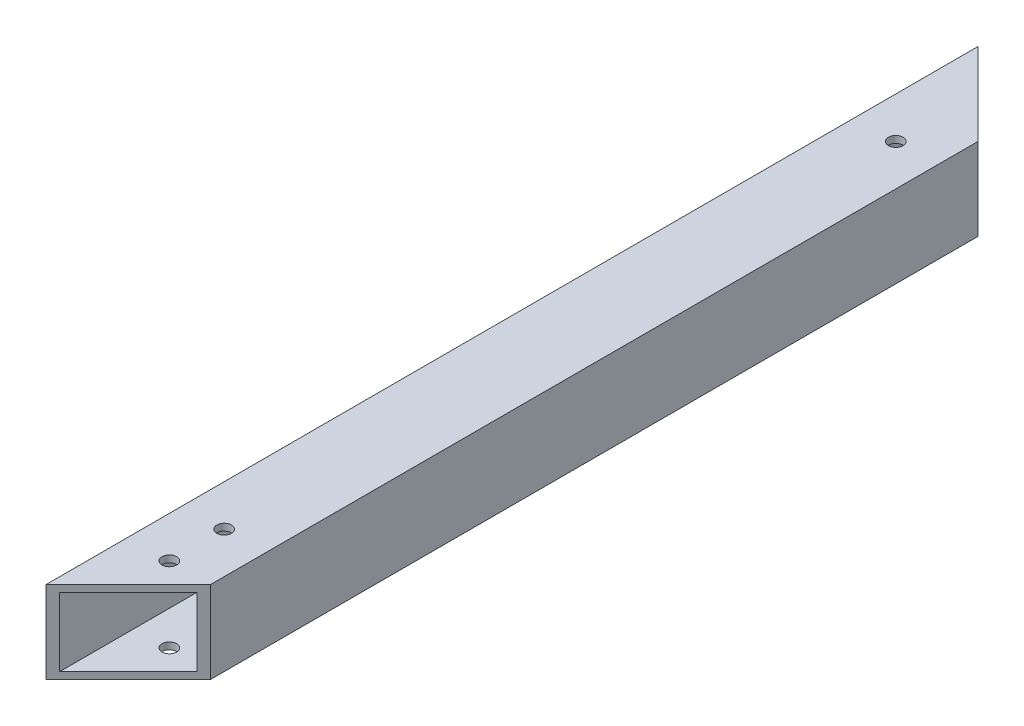
ISO-10303-21;
HEADER;
FILE_DESCRIPTION(('STEP AP214'),'2;1');
FILE_NAME('part.step','',(''),(''),'','','');
FILE_SCHEMA(('AUTOMOTIVE_DESIGN { 1 0 10303 214 1 1 1 1 }'));
ENDSEC;
DATA;
#1=APPLICATION_CONTEXT('core data for automotive mechanical design processes');
#2=APPLICATION_PROTOCOL_DEFINITION('international standard','automotive_design',2000,#1);
#3=PRODUCT_CONTEXT('',#1,'mechanical');
#4=PRODUCT('Part','Part','',(#3));
#5=PRODUCT_RELATED_PRODUCT_CATEGORY('part','',(#4));
#6=PRODUCT_DEFINITION_FORMATION('','',#4);
#7=PRODUCT_DEFINITION_CONTEXT('part definition',#1,'design');
#8=PRODUCT_DEFINITION('design','',#6,#7);
#9=PRODUCT_DEFINITION_SHAPE('','',#8);
#10=(LENGTH_UNIT() NAMED_UNIT(*) SI_UNIT(.MILLI.,.METRE.));
#11=(NAMED_UNIT(*) PLANE_ANGLE_UNIT() SI_UNIT($,.RADIAN.));
#12=(NAMED_UNIT(*) SI_UNIT($,.STERADIAN.) SOLID_ANGLE_UNIT());
#13=UNCERTAINTY_MEASURE_WITH_UNIT(LENGTH_MEASURE(1.E-05),#10,'distance_accuracy_value','');
#14=(GEOMETRIC_REPRESENTATION_CONTEXT(3) GLOBAL_UNCERTAINTY_ASSIGNED_CONTEXT((#13)) GLOBAL_UNIT_ASSIGNED_CONTEXT((#10,
#11,#12)) REPRESENTATION_CONTEXT('',''));
#15=CARTESIAN_POINT('',(0.,0.,0.));
#16=DIRECTION('',(0.,0.,1.));
#17=DIRECTION('',(1.,0.,0.));
#18=AXIS2_PLACEMENT_3D('',#15,#16,#17);
#19=CARTESIAN_POINT('',(-1.14676268481162E-09,-431.9737791549,-158.749999995404));
#20=DIRECTION('',(0.,1.,0.));
#21=DIRECTION('',(1.,0.,0.));
#22=AXIS2_PLACEMENT_3D('',#19,#20,#21);
#23=CYLINDRICAL_SURFACE('',#22,3.3782);
#24=CARTESIAN_POINT('',(-1.14676268481162E-09,0.,-158.749999995404));
#25=DIRECTION('',(0.,1.,0.));
#26=DIRECTION('',(1.,0.,0.));
#27=AXIS2_PLACEMENT_3D('',#24,#25,#26);
#28=CIRCLE('',#27,3.3782);
#29=CARTESIAN_POINT('',(3.37819999885324,0.,-158.749999995404));
#30=VERTEX_POINT('',#29);
#31=EDGE_CURVE('E141',#30,#30,#28,.T.);
#32=ORIENTED_EDGE('',*,*,#31,.F.);
#33=EDGE_LOOP('',(#32));
#34=FACE_BOUND('',#33,.T.);
#35=CARTESIAN_POINT('',(-1.14676268481162E-09,3.17500000000003,-158.749999995404));
#36=DIRECTION('',(0.,-1.,0.));
#37=DIRECTION('',(0.,0.,-1.));
#38=AXIS2_PLACEMENT_3D('',#35,#36,#37);
#39=CIRCLE('',#38,3.3782);
#40=CARTESIAN_POINT('',(-1.14676268481162E-09,3.17500000000003,-162.128199995404));
#41=VERTEX_POINT('',#40);
#42=EDGE_CURVE('E131',#41,#41,#39,.T.);
#43=ORIENTED_EDGE('',*,*,#42,.F.);
#44=EDGE_LOOP('',(#43));
#45=FACE_BOUND('',#44,.T.);
#46=ADVANCED_FACE('F16',(#34,#45),#23,.F.);
#47=CARTESIAN_POINT('',(-1.14674492124323E-09,-397.0487791549,-158.749999995404));
#48=DIRECTION('',(0.,1.,0.));
#49=DIRECTION('',(1.,0.,0.));
#50=AXIS2_PLACEMENT_3D('',#47,#48,#49);
#51=CYLINDRICAL_SURFACE('',#50,3.3782);
#52=CARTESIAN_POINT('',(-1.14674492124323E-09,34.925,-158.749999995404));
#53=DIRECTION('',(0.,1.,0.));
#54=DIRECTION('',(1.,0.,0.));
#55=AXIS2_PLACEMENT_3D('',#52,#53,#54);
#56=CIRCLE('',#55,3.3782);
#57=CARTESIAN_POINT('',(3.37819999885326,34.925,-158.749999995404));
#58=VERTEX_POINT('',#57);
#59=EDGE_CURVE('E148',#58,#58,#56,.T.);
#60=ORIENTED_EDGE('',*,*,#59,.F.);
#61=EDGE_LOOP('',(#60));
#62=FACE_BOUND('',#61,.T.);
#63=CARTESIAN_POINT('',(-1.14674492124323E-09,38.1,-158.749999995404));
#64=DIRECTION('',(0.,-1.,0.));
#65=DIRECTION('',(0.,0.,-1.));
#66=AXIS2_PLACEMENT_3D('',#63,#64,#65);
#67=CIRCLE('',#66,3.3782);
#68=CARTESIAN_POINT('',(-1.14674492124323E-09,38.1,-162.128199995404));
#69=VERTEX_POINT('',#68);
#70=EDGE_CURVE('E136',#69,#69,#67,.T.);
#71=ORIENTED_EDGE('',*,*,#70,.F.);
#72=EDGE_LOOP('',(#71));
#73=FACE_BOUND('',#72,.T.);
#74=ADVANCED_FACE('F182',(#62,#73),#51,.F.);
#75=CARTESIAN_POINT('',(1.28219213024749E-09,-431.973779155024,177.800000004579));
#76=DIRECTION('',(0.,1.,0.));
#77=DIRECTION('',(1.,0.,0.));
#78=AXIS2_PLACEMENT_3D('',#75,#76,#77);
#79=CYLINDRICAL_SURFACE('',#78,3.3782);
#80=CARTESIAN_POINT('',(1.28219213024749E-09,0.,177.800000004579));
#81=DIRECTION('',(0.,1.,0.));
#82=DIRECTION('',(1.,0.,0.));
#83=AXIS2_PLACEMENT_3D('',#80,#81,#82);
#84=CIRCLE('',#83,3.3782);
#85=CARTESIAN_POINT('',(3.37820000128219,0.,177.800000004579));
#86=VERTEX_POINT('',#85);
#87=EDGE_CURVE('E277',#86,#86,#84,.T.);
#88=ORIENTED_EDGE('',*,*,#87,.F.);
#89=EDGE_LOOP('',(#88));
#90=FACE_BOUND('',#89,.T.);
#91=CARTESIAN_POINT('',(1.28219213024749E-09,3.17500000000003,177.800000004579));
#92=DIRECTION('',(0.,-1.,0.));
#93=DIRECTION('',(0.,0.,-1.));
#94=AXIS2_PLACEMENT_3D('',#91,#92,#93);
#95=CIRCLE('',#94,3.3782);
#96=CARTESIAN_POINT('',(1.28219213024749E-09,3.17500000000003,174.421800004579));
#97=VERTEX_POINT('',#96);
#98=EDGE_CURVE('E274',#97,#97,#95,.T.);
#99=ORIENTED_EDGE('',*,*,#98,.F.);
#100=EDGE_LOOP('',(#99));
#101=FACE_BOUND('',#100,.T.);
#102=ADVANCED_FACE('F188',(#90,#101),#79,.F.);
#103=CARTESIAN_POINT('',(1.09888986798978E-09,-431.973779155024,152.40000000458));
#104=DIRECTION('',(0.,1.,0.));
#105=DIRECTION('',(1.,0.,0.));
#106=AXIS2_PLACEMENT_3D('',#103,#104,#105);
#107=CYLINDRICAL_SURFACE('',#106,3.3782);
#108=CARTESIAN_POINT('',(1.09888986798978E-09,0.,152.40000000458));
#109=DIRECTION('',(0.,1.,0.));
#110=DIRECTION('',(1.,0.,0.));
#111=AXIS2_PLACEMENT_3D('',#108,#109,#110);
#112=CIRCLE('',#111,3.3782);
#113=CARTESIAN_POINT('',(3.37820000109889,0.,152.40000000458));
#114=VERTEX_POINT('',#113);
#115=EDGE_CURVE('E119',#114,#114,#112,.T.);
#116=ORIENTED_EDGE('',*,*,#115,.F.);
#117=EDGE_LOOP('',(#116));
#118=FACE_BOUND('',#117,.T.);
#119=CARTESIAN_POINT('',(1.09888986798978E-09,3.17500000000003,152.40000000458));
#120=DIRECTION('',(0.,-1.,0.));
#121=DIRECTION('',(0.,0.,-1.));
#122=AXIS2_PLACEMENT_3D('',#119,#120,#121);
#123=CIRCLE('',#122,3.3782);
#124=CARTESIAN_POINT('',(1.09888986798978E-09,3.17500000000003,149.02180000458));
#125=VERTEX_POINT('',#124);
#126=EDGE_CURVE('E158',#125,#125,#123,.T.);
#127=ORIENTED_EDGE('',*,*,#126,.F.);
#128=EDGE_LOOP('',(#127));
#129=FACE_BOUND('',#128,.T.);
#130=ADVANCED_FACE('F196',(#118,#129),#107,.F.);
#131=CARTESIAN_POINT('',(1.28219213024749E-09,-397.048779155024,177.800000004579));
#132=DIRECTION('',(0.,1.,0.));
#133=DIRECTION('',(1.,0.,0.));
#134=AXIS2_PLACEMENT_3D('',#131,#132,#133);
#135=CYLINDRICAL_SURFACE('',#134,3.3782);
#136=CARTESIAN_POINT('',(1.28219213024749E-09,34.925,177.800000004579));
#137=DIRECTION('',(0.,1.,0.));
#138=DIRECTION('',(1.,0.,0.));
#139=AXIS2_PLACEMENT_3D('',#136,#137,#138);
#140=CIRCLE('',#139,3.3782);
#141=CARTESIAN_POINT('',(3.37820000128219,34.925,177.800000004579));
#142=VERTEX_POINT('',#141);
#143=EDGE_CURVE('E264',#142,#142,#140,.T.);
#144=ORIENTED_EDGE('',*,*,#143,.F.);
#145=EDGE_LOOP('',(#144));
#146=FACE_BOUND('',#145,.T.);
#147=CARTESIAN_POINT('',(1.28219213024749E-09,38.1,177.800000004579));
#148=DIRECTION('',(0.,-1.,0.));
#149=DIRECTION('',(0.,0.,-1.));
#150=AXIS2_PLACEMENT_3D('',#147,#148,#149);
#151=CIRCLE('',#150,3.3782);
#152=CARTESIAN_POINT('',(1.28219213024749E-09,38.1,174.421800004579));
#153=VERTEX_POINT('',#152);
#154=EDGE_CURVE('E108',#153,#153,#151,.T.);
#155=ORIENTED_EDGE('',*,*,#154,.F.);
#156=EDGE_LOOP('',(#155));
#157=FACE_BOUND('',#156,.T.);
#158=ADVANCED_FACE('F200',(#146,#157),#135,.F.);
#159=CARTESIAN_POINT('',(1.09888986798978E-09,-397.048779155024,152.40000000458));
#160=DIRECTION('',(0.,1.,0.));
#161=DIRECTION('',(1.,0.,0.));
#162=AXIS2_PLACEMENT_3D('',#159,#160,#161);
#163=CYLINDRICAL_SURFACE('',#162,3.3782);
#164=CARTESIAN_POINT('',(1.09888986798978E-09,34.925,152.40000000458));
#165=DIRECTION('',(0.,1.,0.));
#166=DIRECTION('',(1.,0.,0.));
#167=AXIS2_PLACEMENT_3D('',#164,#165,#166);
#168=CIRCLE('',#167,3.3782);
#169=CARTESIAN_POINT('',(3.37820000109889,34.925,152.40000000458));
#170=VERTEX_POINT('',#169);
#171=EDGE_CURVE('E267',#170,#170,#168,.T.);
#172=ORIENTED_EDGE('',*,*,#171,.F.);
#173=EDGE_LOOP('',(#172));
#174=FACE_BOUND('',#173,.T.);
#175=CARTESIAN_POINT('',(1.09888986798978E-09,38.1,152.40000000458));
#176=DIRECTION('',(0.,-1.,0.));
#177=DIRECTION('',(0.,0.,-1.));
#178=AXIS2_PLACEMENT_3D('',#175,#176,#177);
#179=CIRCLE('',#178,3.3782);
#180=CARTESIAN_POINT('',(1.09888986798978E-09,38.1,149.02180000458));
#181=VERTEX_POINT('',#180);
#182=EDGE_CURVE('E105',#181,#181,#179,.T.);
#183=ORIENTED_EDGE('',*,*,#182,.F.);
#184=EDGE_LOOP('',(#183));
#185=FACE_BOUND('',#184,.T.);
#186=ADVANCED_FACE('F204',(#174,#185),#163,.F.);
#187=CARTESIAN_POINT('',(-19.05,-0.00100000000000211,-215.9));
#188=DIRECTION('',(-0.707106781170062,0.,0.707106781203033));
#189=DIRECTION('',(0.707106781203033,0.,0.707106781170062));
#190=AXIS2_PLACEMENT_3D('',#187,#188,#189);
#191=PLANE('',#190);
#192=DIRECTION('',(0.,1.,0.));
#193=VECTOR('',#192,1.);
#194=CARTESIAN_POINT('',(-15.875,-0.000500000000001055,-212.725000000148));
#195=LINE('',#194,#193);
#196=CARTESIAN_POINT('',(-15.875,3.175,-212.725000000148));
#197=VERTEX_POINT('',#196);
#198=CARTESIAN_POINT('',(-15.875,34.925,-212.725000000148));
#199=VERTEX_POINT('',#198);
#200=EDGE_CURVE('E35',#197,#199,#195,.T.);
#201=ORIENTED_EDGE('',*,*,#200,.F.);
#202=DIRECTION('',(-0.707106781203033,0.,-0.707106781170062));
#203=VECTOR('',#202,1.);
#204=CARTESIAN_POINT('',(39.6875000002221,3.175,-157.162500002517));
#205=LINE('',#204,#203);
#206=CARTESIAN_POINT('',(15.875,3.175,-180.975000001629));
#207=VERTEX_POINT('',#206);
#208=EDGE_CURVE('E140',#207,#197,#205,.T.);
#209=ORIENTED_EDGE('',*,*,#208,.F.);
#210=DIRECTION('',(0.,-1.,0.));
#211=VECTOR('',#210,1.);
#212=CARTESIAN_POINT('',(15.875,-0.000500000000001055,-180.975000001629));
#213=LINE('',#212,#211);
#214=CARTESIAN_POINT('',(15.875,34.925,-180.975000001629));
#215=VERTEX_POINT('',#214);
#216=EDGE_CURVE('E26',#215,#207,#213,.T.);
#217=ORIENTED_EDGE('',*,*,#216,.F.);
#218=DIRECTION('',(0.707106781203033,0.,0.707106781170062));
#219=VECTOR('',#218,1.);
#220=CARTESIAN_POINT('',(39.6875000002221,34.925,-157.162500002517));
#221=LINE('',#220,#219);
#222=EDGE_CURVE('E112',#199,#215,#221,.T.);
#223=ORIENTED_EDGE('',*,*,#222,.F.);
#224=EDGE_LOOP('',(#201,#209,#217,#223));
#225=FACE_BOUND('',#224,.T.);
#226=DIRECTION('',(-0.707106781203033,0.,-0.707106781170062));
#227=VECTOR('',#226,1.);
#228=CARTESIAN_POINT('',(39.6875000002221,38.1,-157.162500002517));
#229=LINE('',#228,#227);
#230=CARTESIAN_POINT('',(19.05,38.1,-177.800000001777));
#231=VERTEX_POINT('',#230);
#232=CARTESIAN_POINT('',(-19.05,38.1,-215.9));
#233=VERTEX_POINT('',#232);
#234=EDGE_CURVE('E104',#231,#233,#229,.T.);
#235=ORIENTED_EDGE('',*,*,#234,.F.);
#236=DIRECTION('',(0.,1.,0.));
#237=VECTOR('',#236,1.);
#238=CARTESIAN_POINT('',(19.05,-0.000500000000001055,-177.800000001777));
#239=LINE('',#238,#237);
#240=CARTESIAN_POINT('',(19.05,0.,-177.800000001777));
#241=VERTEX_POINT('',#240);
#242=EDGE_CURVE('E114',#241,#231,#239,.T.);
#243=ORIENTED_EDGE('',*,*,#242,.F.);
#244=DIRECTION('',(0.707106781203033,0.,0.707106781170062));
#245=VECTOR('',#244,1.);
#246=CARTESIAN_POINT('',(39.6875000002221,0.,-157.162500002517));
#247=LINE('',#246,#245);
#248=CARTESIAN_POINT('',(-19.05,0.,-215.9));
#249=VERTEX_POINT('',#248);
#250=EDGE_CURVE('E117',#249,#241,#247,.T.);
#251=ORIENTED_EDGE('',*,*,#250,.F.);
#252=DIRECTION('',(0.,1.,0.));
#253=VECTOR('',#252,1.);
#254=CARTESIAN_POINT('',(-19.05,0.,-215.9));
#255=LINE('',#254,#253);
#256=EDGE_CURVE('E11',#249,#233,#255,.T.);
#257=ORIENTED_EDGE('',*,*,#256,.T.);
#258=EDGE_LOOP('',(#235,#243,#251,#257));
#259=FACE_BOUND('',#258,.T.);
#260=ADVANCED_FACE('F208',(#225,#259),#191,.F.);
#261=CARTESIAN_POINT('',(15.875,0.,215.9));
#262=DIRECTION('',(1.,0.,0.));
#263=DIRECTION('',(0.,0.,-1.));
#264=AXIS2_PLACEMENT_3D('',#261,#262,#263);
#265=PLANE('',#264);
#266=ORIENTED_EDGE('',*,*,#216,.T.);
#267=DIRECTION('',(0.,0.,1.));
#268=VECTOR('',#267,1.);
#269=CARTESIAN_POINT('',(15.875,3.175,107.95));
#270=LINE('',#269,#268);
#271=CARTESIAN_POINT('',(15.875,3.175,180.974999998953));
#272=VERTEX_POINT('',#271);
#273=EDGE_CURVE('E122',#207,#272,#270,.T.);
#274=ORIENTED_EDGE('',*,*,#273,.T.);
#275=DIRECTION('',(0.,1.,0.));
#276=VECTOR('',#275,1.);
#277=CARTESIAN_POINT('',(15.875,-0.000500000000001055,180.974999998953));
#278=LINE('',#277,#276);
#279=CARTESIAN_POINT('',(15.875,34.925,180.974999998953));
#280=VERTEX_POINT('',#279);
#281=EDGE_CURVE('E125',#272,#280,#278,.T.);
#282=ORIENTED_EDGE('',*,*,#281,.T.);
#283=DIRECTION('',(0.,0.,-1.));
#284=VECTOR('',#283,1.);
#285=CARTESIAN_POINT('',(15.875,34.925,107.95));
#286=LINE('',#285,#284);
#287=EDGE_CURVE('E128',#280,#215,#286,.T.);
#288=ORIENTED_EDGE('',*,*,#287,.T.);
#289=EDGE_LOOP('',(#266,#274,#282,#288));
#290=FACE_BOUND('',#289,.T.);
#291=ADVANCED_FACE('F163',(#290),#265,.F.);
#292=CARTESIAN_POINT('',(0.,3.175,0.));
#293=DIRECTION('',(0.,1.,0.));
#294=DIRECTION('',(0.,0.,1.));
#295=AXIS2_PLACEMENT_3D('',#292,#293,#294);
#296=PLANE('',#295);
#297=ORIENTED_EDGE('',*,*,#42,.T.);
#298=EDGE_LOOP('',(#297));
#299=FACE_BOUND('',#298,.T.);
#300=ORIENTED_EDGE('',*,*,#98,.T.);
#301=EDGE_LOOP('',(#300));
#302=FACE_BOUND('',#301,.T.);
#303=ORIENTED_EDGE('',*,*,#126,.T.);
#304=EDGE_LOOP('',(#303));
#305=FACE_BOUND('',#304,.T.);
#306=ORIENTED_EDGE('',*,*,#208,.T.);
#307=DIRECTION('',(0.,0.,-1.));
#308=VECTOR('',#307,1.);
#309=CARTESIAN_POINT('',(-15.875,3.175,-107.95));
#310=LINE('',#309,#308);
#311=CARTESIAN_POINT('',(-15.875,3.175,212.724999999905));
#312=VERTEX_POINT('',#311);
#313=EDGE_CURVE('E132',#312,#197,#310,.T.);
#314=ORIENTED_EDGE('',*,*,#313,.F.);
#315=DIRECTION('',(0.707106781175949,0.,-0.707106781197146));
#316=VECTOR('',#315,1.);
#317=CARTESIAN_POINT('',(39.6874999998572,3.175,157.162499998382));
#318=LINE('',#317,#316);
#319=EDGE_CURVE('E137',#312,#272,#318,.T.);
#320=ORIENTED_EDGE('',*,*,#319,.T.);
#321=ORIENTED_EDGE('',*,*,#273,.F.);
#322=EDGE_LOOP('',(#306,#314,#320,#321));
#323=FACE_BOUND('',#322,.T.);
#324=ADVANCED_FACE('F165',(#299,#302,#305,#323),#296,.T.);
#325=CARTESIAN_POINT('',(0.,0.,0.));
#326=DIRECTION('',(0.,1.,0.));
#327=DIRECTION('',(0.,0.,1.));
#328=AXIS2_PLACEMENT_3D('',#325,#326,#327);
#329=PLANE('',#328);
#330=ORIENTED_EDGE('',*,*,#31,.T.);
#331=EDGE_LOOP('',(#330));
#332=FACE_BOUND('',#331,.T.);
#333=ORIENTED_EDGE('',*,*,#87,.T.);
#334=EDGE_LOOP('',(#333));
#335=FACE_BOUND('',#334,.T.);
#336=ORIENTED_EDGE('',*,*,#115,.T.);
#337=EDGE_LOOP('',(#336));
#338=FACE_BOUND('',#337,.T.);
#339=ORIENTED_EDGE('',*,*,#250,.T.);
#340=DIRECTION('',(0.,0.,1.));
#341=VECTOR('',#340,1.);
#342=CARTESIAN_POINT('',(19.05,0.,-215.9));
#343=LINE('',#342,#341);
#344=CARTESIAN_POINT('',(19.05,0.,177.799999998858));
#345=VERTEX_POINT('',#344);
#346=EDGE_CURVE('E120',#241,#345,#343,.T.);
#347=ORIENTED_EDGE('',*,*,#346,.T.);
#348=DIRECTION('',(-0.707106781175949,0.,0.707106781197146));
#349=VECTOR('',#348,1.);
#350=CARTESIAN_POINT('',(39.6874999998572,0.,157.162499998382));
#351=LINE('',#350,#349);
#352=CARTESIAN_POINT('',(-19.05,0.,215.9));
#353=VERTEX_POINT('',#352);
#354=EDGE_CURVE('E144',#345,#353,#351,.T.);
#355=ORIENTED_EDGE('',*,*,#354,.T.);
#356=DIRECTION('',(0.,0.,-1.));
#357=VECTOR('',#356,1.);
#358=CARTESIAN_POINT('',(-19.05,0.,215.9));
#359=LINE('',#358,#357);
#360=EDGE_CURVE('E89',#353,#249,#359,.T.);
#361=ORIENTED_EDGE('',*,*,#360,.T.);
#362=EDGE_LOOP('',(#339,#347,#355,#361));
#363=FACE_BOUND('',#362,.T.);
#364=ADVANCED_FACE('F216',(#332,#335,#338,#363),#329,.F.);
#365=CARTESIAN_POINT('',(19.05,0.,215.9));
#366=DIRECTION('',(1.,0.,0.));
#367=DIRECTION('',(0.,0.,-1.));
#368=AXIS2_PLACEMENT_3D('',#365,#366,#367);
#369=PLANE('',#368);
#370=ORIENTED_EDGE('',*,*,#242,.T.);
#371=DIRECTION('',(0.,0.,-1.));
#372=VECTOR('',#371,1.);
#373=CARTESIAN_POINT('',(19.05,38.1,-215.9));
#374=LINE('',#373,#372);
#375=CARTESIAN_POINT('',(19.05,38.1,177.799999998858));
#376=VERTEX_POINT('',#375);
#377=EDGE_CURVE('E101',#376,#231,#374,.T.);
#378=ORIENTED_EDGE('',*,*,#377,.F.);
#379=DIRECTION('',(0.,-1.,0.));
#380=VECTOR('',#379,1.);
#381=CARTESIAN_POINT('',(19.05,-0.000500000000001055,177.799999998858));
#382=LINE('',#381,#380);
#383=EDGE_CURVE('E98',#376,#345,#382,.T.);
#384=ORIENTED_EDGE('',*,*,#383,.T.);
#385=ORIENTED_EDGE('',*,*,#346,.F.);
#386=EDGE_LOOP('',(#370,#378,#384,#385));
#387=FACE_BOUND('',#386,.T.);
#388=ADVANCED_FACE('F179',(#387),#369,.T.);
#389=CARTESIAN_POINT('',(-19.05,-0.00100000000000211,215.9));
#390=DIRECTION('',(0.707106781197146,0.,0.707106781175949));
#391=DIRECTION('',(0.707106781175949,0.,-0.707106781197146));
#392=AXIS2_PLACEMENT_3D('',#389,#390,#391);
#393=PLANE('',#392);
#394=ORIENTED_EDGE('',*,*,#281,.F.);
#395=ORIENTED_EDGE('',*,*,#319,.F.);
#396=DIRECTION('',(0.,-1.,0.));
#397=VECTOR('',#396,1.);
#398=CARTESIAN_POINT('',(-15.875,-0.000500000000001055,212.724999999905));
#399=LINE('',#398,#397);
#400=CARTESIAN_POINT('',(-15.875,34.925,212.724999999905));
#401=VERTEX_POINT('',#400);
#402=EDGE_CURVE('E135',#401,#312,#399,.T.);
#403=ORIENTED_EDGE('',*,*,#402,.F.);
#404=DIRECTION('',(-0.707106781175949,0.,0.707106781197146));
#405=VECTOR('',#404,1.);
#406=CARTESIAN_POINT('',(39.6874999998572,34.925,157.162499998382));
#407=LINE('',#406,#405);
#408=EDGE_CURVE('E78',#280,#401,#407,.T.);
#409=ORIENTED_EDGE('',*,*,#408,.F.);
#410=EDGE_LOOP('',(#394,#395,#403,#409));
#411=FACE_BOUND('',#410,.T.);
#412=ORIENTED_EDGE('',*,*,#383,.F.);
#413=DIRECTION('',(0.707106781175949,0.,-0.707106781197146));
#414=VECTOR('',#413,1.);
#415=CARTESIAN_POINT('',(39.6874999998572,38.1,157.162499998382));
#416=LINE('',#415,#414);
#417=CARTESIAN_POINT('',(-19.05,38.1,215.9));
#418=VERTEX_POINT('',#417);
#419=EDGE_CURVE('E95',#418,#376,#416,.T.);
#420=ORIENTED_EDGE('',*,*,#419,.F.);
#421=DIRECTION('',(0.,1.,0.));
#422=VECTOR('',#421,1.);
#423=CARTESIAN_POINT('',(-19.05,0.,215.9));
#424=LINE('',#423,#422);
#425=EDGE_CURVE('E84',#353,#418,#424,.T.);
#426=ORIENTED_EDGE('',*,*,#425,.F.);
#427=ORIENTED_EDGE('',*,*,#354,.F.);
#428=EDGE_LOOP('',(#412,#420,#426,#427));
#429=FACE_BOUND('',#428,.T.);
#430=ADVANCED_FACE('F96',(#411,#429),#393,.T.);
#431=CARTESIAN_POINT('',(-15.875,0.,-215.9));
#432=DIRECTION('',(-1.,0.,0.));
#433=DIRECTION('',(0.,0.,1.));
#434=AXIS2_PLACEMENT_3D('',#431,#432,#433);
#435=PLANE('',#434);
#436=ORIENTED_EDGE('',*,*,#200,.T.);
#437=DIRECTION('',(0.,0.,1.));
#438=VECTOR('',#437,1.);
#439=CARTESIAN_POINT('',(-15.875,34.925,-107.95));
#440=LINE('',#439,#438);
#441=EDGE_CURVE('E152',#199,#401,#440,.T.);
#442=ORIENTED_EDGE('',*,*,#441,.T.);
#443=ORIENTED_EDGE('',*,*,#402,.T.);
#444=ORIENTED_EDGE('',*,*,#313,.T.);
#445=EDGE_LOOP('',(#436,#442,#443,#444));
#446=FACE_BOUND('',#445,.T.);
#447=ADVANCED_FACE('F168',(#446),#435,.F.);
#448=CARTESIAN_POINT('',(0.,38.1,0.));
#449=DIRECTION('',(0.,1.,0.));
#450=DIRECTION('',(0.,0.,1.));
#451=AXIS2_PLACEMENT_3D('',#448,#449,#450);
#452=PLANE('',#451);
#453=ORIENTED_EDGE('',*,*,#70,.T.);
#454=EDGE_LOOP('',(#453));
#455=FACE_BOUND('',#454,.T.);
#456=ORIENTED_EDGE('',*,*,#154,.T.);
#457=EDGE_LOOP('',(#456));
#458=FACE_BOUND('',#457,.T.);
#459=ORIENTED_EDGE('',*,*,#182,.T.);
#460=EDGE_LOOP('',(#459));
#461=FACE_BOUND('',#460,.T.);
#462=ORIENTED_EDGE('',*,*,#234,.T.);
#463=DIRECTION('',(0.,0.,1.));
#464=VECTOR('',#463,1.);
#465=CARTESIAN_POINT('',(-19.05,38.1,215.9));
#466=LINE('',#465,#464);
#467=EDGE_CURVE('E20',#233,#418,#466,.T.);
#468=ORIENTED_EDGE('',*,*,#467,.T.);
#469=ORIENTED_EDGE('',*,*,#419,.T.);
#470=ORIENTED_EDGE('',*,*,#377,.T.);
#471=EDGE_LOOP('',(#462,#468,#469,#470));
#472=FACE_BOUND('',#471,.T.);
#473=ADVANCED_FACE('F103',(#455,#458,#461,#472),#452,.T.);
#474=CARTESIAN_POINT('',(0.,34.925,0.));
#475=DIRECTION('',(0.,1.,0.));
#476=DIRECTION('',(0.,0.,1.));
#477=AXIS2_PLACEMENT_3D('',#474,#475,#476);
#478=PLANE('',#477);
#479=ORIENTED_EDGE('',*,*,#59,.T.);
#480=EDGE_LOOP('',(#479));
#481=FACE_BOUND('',#480,.T.);
#482=ORIENTED_EDGE('',*,*,#143,.T.);
#483=EDGE_LOOP('',(#482));
#484=FACE_BOUND('',#483,.T.);
#485=ORIENTED_EDGE('',*,*,#171,.T.);
#486=EDGE_LOOP('',(#485));
#487=FACE_BOUND('',#486,.T.);
#488=ORIENTED_EDGE('',*,*,#222,.T.);
#489=ORIENTED_EDGE('',*,*,#287,.F.);
#490=ORIENTED_EDGE('',*,*,#408,.T.);
#491=ORIENTED_EDGE('',*,*,#441,.F.);
#492=EDGE_LOOP('',(#488,#489,#490,#491));
#493=FACE_BOUND('',#492,.T.);
#494=ADVANCED_FACE('F176',(#481,#484,#487,#493),#478,.F.);
#495=CARTESIAN_POINT('',(-19.05,0.,-215.9));
#496=DIRECTION('',(-1.,0.,0.));
#497=DIRECTION('',(0.,0.,1.));
#498=AXIS2_PLACEMENT_3D('',#495,#496,#497);
#499=PLANE('',#498);
#500=ORIENTED_EDGE('',*,*,#360,.F.);
#501=ORIENTED_EDGE('',*,*,#425,.T.);
#502=ORIENTED_EDGE('',*,*,#467,.F.);
#503=ORIENTED_EDGE('',*,*,#256,.F.);
#504=EDGE_LOOP('',(#500,#501,#502,#503));
#505=FACE_BOUND('',#504,.T.);
#506=ADVANCED_FACE('F18',(#505),#499,.T.);
#507=CLOSED_SHELL('',(#46,#74,#102,#130,#158,#186,#260,#291,#324,#364,#388,#430,#447,#473,#494,#506));
#508=MANIFOLD_SOLID_BREP('B1',#507);
#509=ADVANCED_BREP_SHAPE_REPRESENTATION('',(#18,#508),#14);
#510=SHAPE_DEFINITION_REPRESENTATION(#9,#509);
ENDSEC;
END-ISO-10303-21;
